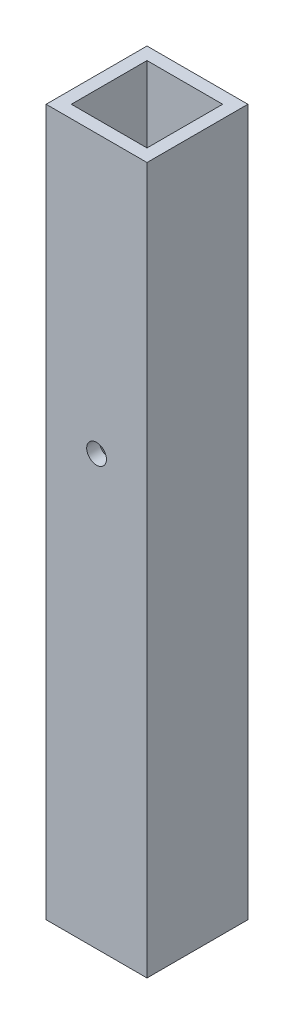
ISO-10303-21;
HEADER;
FILE_DESCRIPTION(('STEP AP214'),'2;1');
FILE_NAME('part.step','',(''),(''),'','','');
FILE_SCHEMA(('AUTOMOTIVE_DESIGN { 1 0 10303 214 1 1 1 1 }'));
ENDSEC;
DATA;
#1=APPLICATION_CONTEXT('core data for automotive mechanical design processes');
#2=APPLICATION_PROTOCOL_DEFINITION('international standard','automotive_design',2000,#1);
#3=PRODUCT_CONTEXT('',#1,'mechanical');
#4=PRODUCT('Part','Part','',(#3));
#5=PRODUCT_RELATED_PRODUCT_CATEGORY('part','',(#4));
#6=PRODUCT_DEFINITION_FORMATION('','',#4);
#7=PRODUCT_DEFINITION_CONTEXT('part definition',#1,'design');
#8=PRODUCT_DEFINITION('design','',#6,#7);
#9=PRODUCT_DEFINITION_SHAPE('','',#8);
#10=(LENGTH_UNIT() NAMED_UNIT(*) SI_UNIT(.MILLI.,.METRE.));
#11=(NAMED_UNIT(*) PLANE_ANGLE_UNIT() SI_UNIT($,.RADIAN.));
#12=(NAMED_UNIT(*) SI_UNIT($,.STERADIAN.) SOLID_ANGLE_UNIT());
#13=UNCERTAINTY_MEASURE_WITH_UNIT(LENGTH_MEASURE(1.E-05),#10,'distance_accuracy_value','');
#14=(GEOMETRIC_REPRESENTATION_CONTEXT(3) GLOBAL_UNCERTAINTY_ASSIGNED_CONTEXT((#13)) GLOBAL_UNIT_ASSIGNED_CONTEXT((#10,
#11,#12)) REPRESENTATION_CONTEXT('',''));
#15=CARTESIAN_POINT('',(0.,0.,0.));
#16=DIRECTION('',(0.,0.,1.));
#17=DIRECTION('',(1.,0.,0.));
#18=AXIS2_PLACEMENT_3D('',#15,#16,#17);
#19=CARTESIAN_POINT('',(6.35000000000008,678.023468227804,-25.4));
#20=DIRECTION('',(0.,1.,0.));
#21=DIRECTION('',(0.,0.,1.));
#22=AXIS2_PLACEMENT_3D('',#19,#20,#21);
#23=PLANE('',#22);
#24=DIRECTION('',(-1.,0.,0.));
#25=VECTOR('',#24,1.);
#26=CARTESIAN_POINT('',(6.35000000000008,678.023468227804,0.));
#27=LINE('',#26,#25);
#28=CARTESIAN_POINT('',(31.7500000000001,678.023468227804,0.));
#29=VERTEX_POINT('',#28);
#30=CARTESIAN_POINT('',(6.35000000000008,678.023468227804,0.));
#31=VERTEX_POINT('',#30);
#32=EDGE_CURVE('E145',#29,#31,#27,.T.);
#33=ORIENTED_EDGE('',*,*,#32,.F.);
#34=DIRECTION('',(0.,0.,1.));
#35=VECTOR('',#34,1.);
#36=CARTESIAN_POINT('',(31.7500000000001,678.023468227804,-25.4));
#37=LINE('',#36,#35);
#38=CARTESIAN_POINT('',(31.7500000000001,678.023468227804,-25.4));
#39=VERTEX_POINT('',#38);
#40=EDGE_CURVE('E48',#39,#29,#37,.T.);
#41=ORIENTED_EDGE('',*,*,#40,.F.);
#42=DIRECTION('',(-1.,0.,0.));
#43=VECTOR('',#42,1.);
#44=CARTESIAN_POINT('',(6.35000000000008,678.023468227804,-25.4));
#45=LINE('',#44,#43);
#46=CARTESIAN_POINT('',(6.35000000000008,678.023468227804,-25.4));
#47=VERTEX_POINT('',#46);
#48=EDGE_CURVE('E151',#39,#47,#45,.T.);
#49=ORIENTED_EDGE('',*,*,#48,.T.);
#50=DIRECTION('',(0.,0.,1.));
#51=VECTOR('',#50,1.);
#52=CARTESIAN_POINT('',(6.35000000000008,678.023468227804,-25.4));
#53=LINE('',#52,#51);
#54=EDGE_CURVE('E11',#47,#31,#53,.T.);
#55=ORIENTED_EDGE('',*,*,#54,.T.);
#56=EDGE_LOOP('',(#33,#41,#49,#55));
#57=FACE_BOUND('',#56,.T.);
#58=DIRECTION('',(0.,0.,1.));
#59=VECTOR('',#58,1.);
#60=CARTESIAN_POINT('',(28.5750000000001,678.023468227804,-25.4));
#61=LINE('',#60,#59);
#62=CARTESIAN_POINT('',(28.5750000000001,678.023468227804,-22.225));
#63=VERTEX_POINT('',#62);
#64=CARTESIAN_POINT('',(28.5750000000001,678.023468227804,-3.175));
#65=VERTEX_POINT('',#64);
#66=EDGE_CURVE('E115',#63,#65,#61,.T.);
#67=ORIENTED_EDGE('',*,*,#66,.T.);
#68=DIRECTION('',(-1.,0.,0.));
#69=VECTOR('',#68,1.);
#70=CARTESIAN_POINT('',(0.,678.023468227804,-3.175));
#71=LINE('',#70,#69);
#72=CARTESIAN_POINT('',(9.52500000000007,678.023468227804,-3.175));
#73=VERTEX_POINT('',#72);
#74=EDGE_CURVE('E121',#65,#73,#71,.T.);
#75=ORIENTED_EDGE('',*,*,#74,.T.);
#76=DIRECTION('',(0.,0.,1.));
#77=VECTOR('',#76,1.);
#78=CARTESIAN_POINT('',(9.52500000000007,678.023468227804,-25.4));
#79=LINE('',#78,#77);
#80=CARTESIAN_POINT('',(9.52500000000007,678.023468227804,-22.225));
#81=VERTEX_POINT('',#80);
#82=EDGE_CURVE('E106',#81,#73,#79,.T.);
#83=ORIENTED_EDGE('',*,*,#82,.F.);
#84=DIRECTION('',(-1.,0.,0.));
#85=VECTOR('',#84,1.);
#86=CARTESIAN_POINT('',(0.,678.023468227804,-22.225));
#87=LINE('',#86,#85);
#88=EDGE_CURVE('E56',#63,#81,#87,.T.);
#89=ORIENTED_EDGE('',*,*,#88,.F.);
#90=EDGE_LOOP('',(#67,#75,#83,#89));
#91=FACE_BOUND('',#90,.T.);
#92=ADVANCED_FACE('F39',(#57,#91),#23,.T.);
#93=CARTESIAN_POINT('',(6.3500000000001,500.223468227803,-25.4));
#94=DIRECTION('',(0.,-1.,0.));
#95=DIRECTION('',(0.,0.,-1.));
#96=AXIS2_PLACEMENT_3D('',#93,#94,#95);
#97=PLANE('',#96);
#98=DIRECTION('',(1.,0.,0.));
#99=VECTOR('',#98,1.);
#100=CARTESIAN_POINT('',(6.3500000000001,500.223468227803,0.));
#101=LINE('',#100,#99);
#102=CARTESIAN_POINT('',(6.3500000000001,500.223468227803,0.));
#103=VERTEX_POINT('',#102);
#104=CARTESIAN_POINT('',(31.7500000000001,500.223468227803,0.));
#105=VERTEX_POINT('',#104);
#106=EDGE_CURVE('E156',#103,#105,#101,.T.);
#107=ORIENTED_EDGE('',*,*,#106,.F.);
#108=DIRECTION('',(0.,0.,1.));
#109=VECTOR('',#108,1.);
#110=CARTESIAN_POINT('',(6.3500000000001,500.223468227803,-25.4));
#111=LINE('',#110,#109);
#112=CARTESIAN_POINT('',(6.3500000000001,500.223468227803,-25.4));
#113=VERTEX_POINT('',#112);
#114=EDGE_CURVE('E43',#113,#103,#111,.T.);
#115=ORIENTED_EDGE('',*,*,#114,.F.);
#116=DIRECTION('',(1.,0.,0.));
#117=VECTOR('',#116,1.);
#118=CARTESIAN_POINT('',(6.3500000000001,500.223468227803,-25.4));
#119=LINE('',#118,#117);
#120=CARTESIAN_POINT('',(31.7500000000001,500.223468227803,-25.4));
#121=VERTEX_POINT('',#120);
#122=EDGE_CURVE('E144',#113,#121,#119,.T.);
#123=ORIENTED_EDGE('',*,*,#122,.T.);
#124=DIRECTION('',(0.,0.,1.));
#125=VECTOR('',#124,1.);
#126=CARTESIAN_POINT('',(31.7500000000001,500.223468227803,-25.4));
#127=LINE('',#126,#125);
#128=EDGE_CURVE('E164',#121,#105,#127,.T.);
#129=ORIENTED_EDGE('',*,*,#128,.T.);
#130=EDGE_LOOP('',(#107,#115,#123,#129));
#131=FACE_BOUND('',#130,.T.);
#132=DIRECTION('',(0.,0.,1.));
#133=VECTOR('',#132,1.);
#134=CARTESIAN_POINT('',(9.5250000000001,500.223468227803,-25.4));
#135=LINE('',#134,#133);
#136=CARTESIAN_POINT('',(9.5250000000001,500.223468227803,-22.225));
#137=VERTEX_POINT('',#136);
#138=CARTESIAN_POINT('',(9.5250000000001,500.223468227803,-3.175));
#139=VERTEX_POINT('',#138);
#140=EDGE_CURVE('E135',#137,#139,#135,.T.);
#141=ORIENTED_EDGE('',*,*,#140,.T.);
#142=DIRECTION('',(1.,0.,0.));
#143=VECTOR('',#142,1.);
#144=CARTESIAN_POINT('',(0.,500.223468227803,-3.175));
#145=LINE('',#144,#143);
#146=CARTESIAN_POINT('',(28.5750000000001,500.223468227803,-3.175));
#147=VERTEX_POINT('',#146);
#148=EDGE_CURVE('E124',#139,#147,#145,.T.);
#149=ORIENTED_EDGE('',*,*,#148,.T.);
#150=DIRECTION('',(0.,0.,1.));
#151=VECTOR('',#150,1.);
#152=CARTESIAN_POINT('',(28.5750000000001,500.223468227803,-25.4));
#153=LINE('',#152,#151);
#154=CARTESIAN_POINT('',(28.5750000000001,500.223468227803,-22.225));
#155=VERTEX_POINT('',#154);
#156=EDGE_CURVE('E133',#155,#147,#153,.T.);
#157=ORIENTED_EDGE('',*,*,#156,.F.);
#158=DIRECTION('',(1.,0.,0.));
#159=VECTOR('',#158,1.);
#160=CARTESIAN_POINT('',(0.,500.223468227803,-22.225));
#161=LINE('',#160,#159);
#162=EDGE_CURVE('E61',#137,#155,#161,.T.);
#163=ORIENTED_EDGE('',*,*,#162,.F.);
#164=EDGE_LOOP('',(#141,#149,#157,#163));
#165=FACE_BOUND('',#164,.T.);
#166=ADVANCED_FACE('F172',(#131,#165),#97,.T.);
#167=CARTESIAN_POINT('',(6.35000000000008,678.023468227804,-25.4));
#168=DIRECTION('',(-1.,0.,0.));
#169=DIRECTION('',(0.,-1.,0.));
#170=AXIS2_PLACEMENT_3D('',#167,#168,#169);
#171=PLANE('',#170);
#172=DIRECTION('',(0.,-1.,0.));
#173=VECTOR('',#172,1.);
#174=CARTESIAN_POINT('',(6.35000000000008,678.023468227804,0.));
#175=LINE('',#174,#173);
#176=EDGE_CURVE('E114',#31,#103,#175,.T.);
#177=ORIENTED_EDGE('',*,*,#176,.F.);
#178=ORIENTED_EDGE('',*,*,#54,.F.);
#179=DIRECTION('',(0.,-1.,0.));
#180=VECTOR('',#179,1.);
#181=CARTESIAN_POINT('',(6.35000000000008,678.023468227804,-25.4));
#182=LINE('',#181,#180);
#183=EDGE_CURVE('E141',#47,#113,#182,.T.);
#184=ORIENTED_EDGE('',*,*,#183,.T.);
#185=ORIENTED_EDGE('',*,*,#114,.T.);
#186=EDGE_LOOP('',(#177,#178,#184,#185));
#187=FACE_BOUND('',#186,.T.);
#188=ADVANCED_FACE('F41',(#187),#171,.T.);
#189=CARTESIAN_POINT('',(31.7500000000001,678.023468227804,-25.4));
#190=DIRECTION('',(1.,0.,0.));
#191=DIRECTION('',(0.,1.,0.));
#192=AXIS2_PLACEMENT_3D('',#189,#190,#191);
#193=PLANE('',#192);
#194=DIRECTION('',(0.,1.,0.));
#195=VECTOR('',#194,1.);
#196=CARTESIAN_POINT('',(31.7500000000001,678.023468227804,0.));
#197=LINE('',#196,#195);
#198=EDGE_CURVE('E159',#105,#29,#197,.T.);
#199=ORIENTED_EDGE('',*,*,#198,.F.);
#200=ORIENTED_EDGE('',*,*,#128,.F.);
#201=DIRECTION('',(0.,1.,0.));
#202=VECTOR('',#201,1.);
#203=CARTESIAN_POINT('',(31.7500000000001,678.023468227804,-25.4));
#204=LINE('',#203,#202);
#205=EDGE_CURVE('E148',#121,#39,#204,.T.);
#206=ORIENTED_EDGE('',*,*,#205,.T.);
#207=ORIENTED_EDGE('',*,*,#40,.T.);
#208=EDGE_LOOP('',(#199,#200,#206,#207));
#209=FACE_BOUND('',#208,.T.);
#210=ADVANCED_FACE('F183',(#209),#193,.T.);
#211=CARTESIAN_POINT('',(0.,0.,-25.4));
#212=DIRECTION('',(0.,0.,1.));
#213=DIRECTION('',(1.,0.,0.));
#214=AXIS2_PLACEMENT_3D('',#211,#212,#213);
#215=PLANE('',#214);
#216=CARTESIAN_POINT('',(19.0500000000001,608.173468227803,-25.4));
#217=DIRECTION('',(0.,0.,-1.));
#218=DIRECTION('',(-1.,0.,0.));
#219=AXIS2_PLACEMENT_3D('',#216,#217,#218);
#220=CIRCLE('',#219,4.76250000000002);
#221=CARTESIAN_POINT('',(14.2875000000001,608.173468227803,-25.4));
#222=VERTEX_POINT('',#221);
#223=EDGE_CURVE('E229',#222,#222,#220,.T.);
#224=ORIENTED_EDGE('',*,*,#223,.F.);
#225=EDGE_LOOP('',(#224));
#226=FACE_BOUND('',#225,.T.);
#227=ORIENTED_EDGE('',*,*,#183,.F.);
#228=ORIENTED_EDGE('',*,*,#48,.F.);
#229=ORIENTED_EDGE('',*,*,#205,.F.);
#230=ORIENTED_EDGE('',*,*,#122,.F.);
#231=EDGE_LOOP('',(#227,#228,#229,#230));
#232=FACE_BOUND('',#231,.T.);
#233=ADVANCED_FACE('F180',(#226,#232),#215,.F.);
#234=CARTESIAN_POINT('',(0.,0.,0.));
#235=DIRECTION('',(0.,0.,1.));
#236=DIRECTION('',(1.,0.,0.));
#237=AXIS2_PLACEMENT_3D('',#234,#235,#236);
#238=PLANE('',#237);
#239=CARTESIAN_POINT('',(19.05,608.173468227803,0.));
#240=DIRECTION('',(0.,0.,1.));
#241=DIRECTION('',(1.,0.,0.));
#242=AXIS2_PLACEMENT_3D('',#239,#240,#241);
#243=CIRCLE('',#242,2.4891999999999);
#244=CARTESIAN_POINT('',(21.5391999999999,608.173468227803,0.));
#245=VERTEX_POINT('',#244);
#246=EDGE_CURVE('E231',#245,#245,#243,.T.);
#247=ORIENTED_EDGE('',*,*,#246,.F.);
#248=EDGE_LOOP('',(#247));
#249=FACE_BOUND('',#248,.T.);
#250=ORIENTED_EDGE('',*,*,#176,.T.);
#251=ORIENTED_EDGE('',*,*,#106,.T.);
#252=ORIENTED_EDGE('',*,*,#198,.T.);
#253=ORIENTED_EDGE('',*,*,#32,.T.);
#254=EDGE_LOOP('',(#250,#251,#252,#253));
#255=FACE_BOUND('',#254,.T.);
#256=ADVANCED_FACE('F175',(#249,#255),#238,.T.);
#257=CARTESIAN_POINT('',(9.52500000000007,678.023468227804,-25.4));
#258=DIRECTION('',(-1.,0.,0.));
#259=DIRECTION('',(0.,-1.,0.));
#260=AXIS2_PLACEMENT_3D('',#257,#258,#259);
#261=PLANE('',#260);
#262=DIRECTION('',(0.,-1.,0.));
#263=VECTOR('',#262,1.);
#264=CARTESIAN_POINT('',(9.52500000000016,0.,-3.175));
#265=LINE('',#264,#263);
#266=EDGE_CURVE('E109',#73,#139,#265,.T.);
#267=ORIENTED_EDGE('',*,*,#266,.T.);
#268=ORIENTED_EDGE('',*,*,#140,.F.);
#269=DIRECTION('',(0.,-1.,0.));
#270=VECTOR('',#269,1.);
#271=CARTESIAN_POINT('',(9.52500000000016,0.,-22.225));
#272=LINE('',#271,#270);
#273=EDGE_CURVE('E111',#81,#137,#272,.T.);
#274=ORIENTED_EDGE('',*,*,#273,.F.);
#275=ORIENTED_EDGE('',*,*,#82,.T.);
#276=EDGE_LOOP('',(#267,#268,#274,#275));
#277=FACE_BOUND('',#276,.T.);
#278=ADVANCED_FACE('F108',(#277),#261,.F.);
#279=CARTESIAN_POINT('',(28.5750000000001,678.023468227804,-25.4));
#280=DIRECTION('',(1.,0.,0.));
#281=DIRECTION('',(0.,1.,0.));
#282=AXIS2_PLACEMENT_3D('',#279,#280,#281);
#283=PLANE('',#282);
#284=DIRECTION('',(0.,1.,0.));
#285=VECTOR('',#284,1.);
#286=CARTESIAN_POINT('',(28.5750000000002,0.,-3.175));
#287=LINE('',#286,#285);
#288=EDGE_CURVE('E127',#147,#65,#287,.T.);
#289=ORIENTED_EDGE('',*,*,#288,.T.);
#290=ORIENTED_EDGE('',*,*,#66,.F.);
#291=DIRECTION('',(0.,1.,0.));
#292=VECTOR('',#291,1.);
#293=CARTESIAN_POINT('',(28.5750000000002,0.,-22.225));
#294=LINE('',#293,#292);
#295=EDGE_CURVE('E136',#155,#63,#294,.T.);
#296=ORIENTED_EDGE('',*,*,#295,.F.);
#297=ORIENTED_EDGE('',*,*,#156,.T.);
#298=EDGE_LOOP('',(#289,#290,#296,#297));
#299=FACE_BOUND('',#298,.T.);
#300=ADVANCED_FACE('F208',(#299),#283,.F.);
#301=CARTESIAN_POINT('',(0.,0.,-22.225));
#302=DIRECTION('',(0.,0.,1.));
#303=DIRECTION('',(1.,0.,0.));
#304=AXIS2_PLACEMENT_3D('',#301,#302,#303);
#305=PLANE('',#304);
#306=CARTESIAN_POINT('',(19.0500000000001,608.173468227803,-22.225));
#307=DIRECTION('',(0.,0.,-1.));
#308=DIRECTION('',(-1.,0.,0.));
#309=AXIS2_PLACEMENT_3D('',#306,#307,#308);
#310=CIRCLE('',#309,4.76250000000002);
#311=CARTESIAN_POINT('',(14.2875000000001,608.173468227803,-22.225));
#312=VERTEX_POINT('',#311);
#313=EDGE_CURVE('E226',#312,#312,#310,.T.);
#314=ORIENTED_EDGE('',*,*,#313,.T.);
#315=EDGE_LOOP('',(#314));
#316=FACE_BOUND('',#315,.T.);
#317=ORIENTED_EDGE('',*,*,#273,.T.);
#318=ORIENTED_EDGE('',*,*,#162,.T.);
#319=ORIENTED_EDGE('',*,*,#295,.T.);
#320=ORIENTED_EDGE('',*,*,#88,.T.);
#321=EDGE_LOOP('',(#317,#318,#319,#320));
#322=FACE_BOUND('',#321,.T.);
#323=ADVANCED_FACE('F204',(#316,#322),#305,.T.);
#324=CARTESIAN_POINT('',(0.,0.,-3.175));
#325=DIRECTION('',(0.,0.,1.));
#326=DIRECTION('',(1.,0.,0.));
#327=AXIS2_PLACEMENT_3D('',#324,#325,#326);
#328=PLANE('',#327);
#329=CARTESIAN_POINT('',(19.05,608.173468227803,-3.175));
#330=DIRECTION('',(0.,0.,1.));
#331=DIRECTION('',(1.,0.,0.));
#332=AXIS2_PLACEMENT_3D('',#329,#330,#331);
#333=CIRCLE('',#332,2.4891999999999);
#334=CARTESIAN_POINT('',(21.5391999999999,608.173468227803,-3.175));
#335=VERTEX_POINT('',#334);
#336=EDGE_CURVE('E125',#335,#335,#333,.T.);
#337=ORIENTED_EDGE('',*,*,#336,.T.);
#338=EDGE_LOOP('',(#337));
#339=FACE_BOUND('',#338,.T.);
#340=ORIENTED_EDGE('',*,*,#266,.F.);
#341=ORIENTED_EDGE('',*,*,#74,.F.);
#342=ORIENTED_EDGE('',*,*,#288,.F.);
#343=ORIENTED_EDGE('',*,*,#148,.F.);
#344=EDGE_LOOP('',(#340,#341,#342,#343));
#345=FACE_BOUND('',#344,.T.);
#346=ADVANCED_FACE('F119',(#339,#345),#328,.F.);
#347=CARTESIAN_POINT('',(19.05,608.173468227803,-3.175));
#348=DIRECTION('',(0.,0.,1.));
#349=DIRECTION('',(1.,0.,0.));
#350=AXIS2_PLACEMENT_3D('',#347,#348,#349);
#351=CYLINDRICAL_SURFACE('',#350,2.4891999999999);
#352=ORIENTED_EDGE('',*,*,#336,.F.);
#353=EDGE_LOOP('',(#352));
#354=FACE_BOUND('',#353,.T.);
#355=ORIENTED_EDGE('',*,*,#246,.T.);
#356=EDGE_LOOP('',(#355));
#357=FACE_BOUND('',#356,.T.);
#358=ADVANCED_FACE('F203',(#354,#357),#351,.F.);
#359=CARTESIAN_POINT('',(19.0500000000001,608.173468227803,-22.225));
#360=DIRECTION('',(0.,0.,-1.));
#361=DIRECTION('',(-1.,0.,0.));
#362=AXIS2_PLACEMENT_3D('',#359,#360,#361);
#363=CYLINDRICAL_SURFACE('',#362,4.76250000000002);
#364=ORIENTED_EDGE('',*,*,#313,.F.);
#365=EDGE_LOOP('',(#364));
#366=FACE_BOUND('',#365,.T.);
#367=ORIENTED_EDGE('',*,*,#223,.T.);
#368=EDGE_LOOP('',(#367));
#369=FACE_BOUND('',#368,.T.);
#370=ADVANCED_FACE('F217',(#366,#369),#363,.F.);
#371=CLOSED_SHELL('',(#92,#166,#188,#210,#233,#256,#278,#300,#323,#346,#358,#370));
#372=MANIFOLD_SOLID_BREP('B2',#371);
#373=ADVANCED_BREP_SHAPE_REPRESENTATION('',(#18,#372),#14);
#374=SHAPE_DEFINITION_REPRESENTATION(#9,#373);
ENDSEC;
END-ISO-10303-21;
